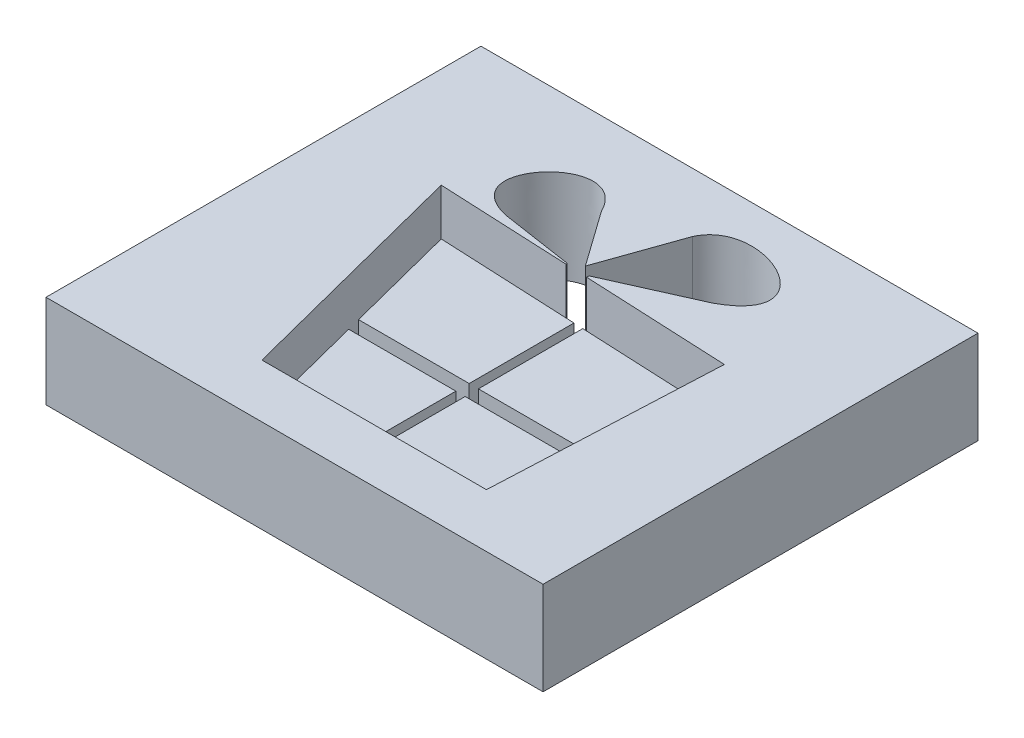
ISO-10303-21;
HEADER;
FILE_DESCRIPTION(('STEP AP214'),'2;1');
FILE_NAME('part.step','',(''),(''),'','','');
FILE_SCHEMA(('AUTOMOTIVE_DESIGN { 1 0 10303 214 1 1 1 1 }'));
ENDSEC;
DATA;
#1=APPLICATION_CONTEXT('core data for automotive mechanical design processes');
#2=APPLICATION_PROTOCOL_DEFINITION('international standard','automotive_design',2000,#1);
#3=PRODUCT_CONTEXT('',#1,'mechanical');
#4=PRODUCT('Part','Part','',(#3));
#5=PRODUCT_RELATED_PRODUCT_CATEGORY('part','',(#4));
#6=PRODUCT_DEFINITION_FORMATION('','',#4);
#7=PRODUCT_DEFINITION_CONTEXT('part definition',#1,'design');
#8=PRODUCT_DEFINITION('design','',#6,#7);
#9=PRODUCT_DEFINITION_SHAPE('','',#8);
#10=(LENGTH_UNIT() NAMED_UNIT(*) SI_UNIT(.MILLI.,.METRE.));
#11=(NAMED_UNIT(*) PLANE_ANGLE_UNIT() SI_UNIT($,.RADIAN.));
#12=(NAMED_UNIT(*) SI_UNIT($,.STERADIAN.) SOLID_ANGLE_UNIT());
#13=UNCERTAINTY_MEASURE_WITH_UNIT(LENGTH_MEASURE(1.E-05),#10,'distance_accuracy_value','');
#14=(GEOMETRIC_REPRESENTATION_CONTEXT(3) GLOBAL_UNCERTAINTY_ASSIGNED_CONTEXT((#13)) GLOBAL_UNIT_ASSIGNED_CONTEXT((#10,
#11,#12)) REPRESENTATION_CONTEXT('',''));
#15=CARTESIAN_POINT('',(0.,0.,0.));
#16=DIRECTION('',(0.,0.,1.));
#17=DIRECTION('',(1.,0.,0.));
#18=AXIS2_PLACEMENT_3D('',#15,#16,#17);
#19=CARTESIAN_POINT('',(0.,3.,0.));
#20=DIRECTION('',(0.,1.,0.));
#21=DIRECTION('',(0.,0.,1.));
#22=AXIS2_PLACEMENT_3D('',#19,#20,#21);
#23=PLANE('',#22);
#24=DIRECTION('',(-0.0462719100433033,0.,0.998928881523077));
#25=VECTOR('',#24,1.);
#26=CARTESIAN_POINT('',(-30.7498081803006,3.,-1.42437803559976));
#27=LINE('',#26,#25);
#28=CARTESIAN_POINT('',(-30.0115129434745,3.,-17.3628693247281));
#29=VERTEX_POINT('',#28);
#30=CARTESIAN_POINT('',(-30.3505741265197,3.,-10.0431367260468));
#31=VERTEX_POINT('',#30);
#32=EDGE_CURVE('E476',#29,#31,#27,.T.);
#33=ORIENTED_EDGE('',*,*,#32,.T.);
#34=DIRECTION('',(-1.,0.,0.));
#35=VECTOR('',#34,1.);
#36=CARTESIAN_POINT('',(0.,3.,-10.0431367260468));
#37=LINE('',#36,#35);
#38=CARTESIAN_POINT('',(-37.5756195592853,3.,-10.0431367260468));
#39=VERTEX_POINT('',#38);
#40=EDGE_CURVE('E474',#31,#39,#37,.T.);
#41=ORIENTED_EDGE('',*,*,#40,.T.);
#42=DIRECTION('',(-0.248559205675402,0.,-0.968616705035595));
#43=VECTOR('',#42,1.);
#44=CARTESIAN_POINT('',(-32.8361631779477,3.,8.42617166781016));
#45=LINE('',#44,#43);
#46=CARTESIAN_POINT('',(-39.56754436517,3.,-17.8055192815914));
#47=VERTEX_POINT('',#46);
#48=EDGE_CURVE('E472',#39,#47,#45,.T.);
#49=ORIENTED_EDGE('',*,*,#48,.T.);
#50=DIRECTION('',(-0.998928881523076,0.,-0.0462719100433034));
#51=VECTOR('',#50,1.);
#52=CARTESIAN_POINT('',(-35.087707092576,3.,-17.5980063834059));
#53=LINE('',#52,#51);
#54=CARTESIAN_POINT('',(-35.3617725375058,3.,-17.6107015130075));
#55=VERTEX_POINT('',#54);
#56=EDGE_CURVE('E248',#55,#47,#53,.T.);
#57=ORIENTED_EDGE('',*,*,#56,.F.);
#58=DIRECTION('',(0.,0.,1.));
#59=VECTOR('',#58,1.);
#60=CARTESIAN_POINT('',(-35.3617725375058,3.,0.));
#61=LINE('',#60,#59);
#62=CARTESIAN_POINT('',(-35.3617725375058,3.,-17.6541575157816));
#63=VERTEX_POINT('',#62);
#64=EDGE_CURVE('E469',#63,#55,#61,.T.);
#65=ORIENTED_EDGE('',*,*,#64,.F.);
#66=DIRECTION('',(0.98874047583337,0.,0.149640473966105));
#67=VECTOR('',#66,1.);
#68=CARTESIAN_POINT('',(1.8202009422397,3.,-12.0268687878527));
#69=LINE('',#68,#67);
#70=CARTESIAN_POINT('',(-37.6692116798901,3.,-18.0033758347984));
#71=VERTEX_POINT('',#70);
#72=EDGE_CURVE('E463',#71,#63,#69,.T.);
#73=ORIENTED_EDGE('',*,*,#72,.F.);
#74=CARTESIAN_POINT('',(-36.2576195279127,3.,-19.6502333454386));
#75=CARTESIAN_POINT('',(-37.3044617868873,3.,-21.7599321493884));
#76=CARTESIAN_POINT('',(-40.1556847180606,3.,-18.5404443526235));
#77=CARTESIAN_POINT('',(-37.6692116798901,3.,-18.0033758347984));
#78=B_SPLINE_CURVE_WITH_KNOTS('',3,(#74,#75,#76,#77),.UNSPECIFIED.,.F.,.F.,(4,4),(0.,1.),.UNSPECIFIED.);
#79=CARTESIAN_POINT('',(-36.2576195279127,3.,-19.6502333454386));
#80=VERTEX_POINT('',#79);
#81=EDGE_CURVE('E459',#80,#71,#78,.T.);
#82=ORIENTED_EDGE('',*,*,#81,.F.);
#83=DIRECTION('',(0.579237483763863,0.,0.815158841823426));
#84=VECTOR('',#83,1.);
#85=CARTESIAN_POINT('',(-14.8143441725471,3.,10.5268114652638));
#86=LINE('',#85,#84);
#87=CARTESIAN_POINT('',(-34.99189926241,3.,-17.8689897370394));
#88=VERTEX_POINT('',#87);
#89=EDGE_CURVE('E294',#80,#88,#86,.T.);
#90=ORIENTED_EDGE('',*,*,#89,.T.);
#91=DIRECTION('',(-0.333335642583817,0.,0.942808225135544));
#92=VECTOR('',#91,1.);
#93=CARTESIAN_POINT('',(-36.7195723222432,3.,-12.9824304764399));
#94=LINE('',#93,#92);
#95=CARTESIAN_POINT('',(-34.0907017507545,3.,-20.4179413579176));
#96=VERTEX_POINT('',#95);
#97=EDGE_CURVE('E298',#96,#88,#94,.T.);
#98=ORIENTED_EDGE('',*,*,#97,.F.);
#99=CARTESIAN_POINT('',(-31.9114015862982,3.,-18.8834351512072));
#100=CARTESIAN_POINT('',(-29.3742741961698,3.,-20.248494332071));
#101=CARTESIAN_POINT('',(-33.3058977177686,3.,-22.1352767339237));
#102=CARTESIAN_POINT('',(-34.0907017507545,3.,-20.4179413579176));
#103=B_SPLINE_CURVE_WITH_KNOTS('',3,(#99,#100,#101,#102),.UNSPECIFIED.,.F.,.F.,(4,4),(0.,1.),.UNSPECIFIED.);
#104=CARTESIAN_POINT('',(-31.9114015862982,3.,-18.8834351512072));
#105=VERTEX_POINT('',#104);
#106=EDGE_CURVE('E483',#105,#96,#103,.T.);
#107=ORIENTED_EDGE('',*,*,#106,.F.);
#108=DIRECTION('',(-0.912754634382309,0.,0.408508234205405));
#109=VECTOR('',#108,1.);
#110=CARTESIAN_POINT('',(-12.3663666828324,3.,-27.6309203954767));
#111=LINE('',#110,#109);
#112=CARTESIAN_POINT('',(-34.6580508940158,3.,-17.6541575157817));
#113=VERTEX_POINT('',#112);
#114=EDGE_CURVE('E481',#105,#113,#111,.T.);
#115=ORIENTED_EDGE('',*,*,#114,.T.);
#116=DIRECTION('',(0.,0.,1.));
#117=VECTOR('',#116,1.);
#118=CARTESIAN_POINT('',(-34.6580508940158,3.,0.));
#119=LINE('',#118,#117);
#120=CARTESIAN_POINT('',(-34.6580508940158,3.,-17.5781040526824));
#121=VERTEX_POINT('',#120);
#122=EDGE_CURVE('E478',#113,#121,#119,.T.);
#123=ORIENTED_EDGE('',*,*,#122,.T.);
#124=EDGE_CURVE('E240',#29,#121,#53,.T.);
#125=ORIENTED_EDGE('',*,*,#124,.F.);
#126=EDGE_LOOP('',(#33,#41,#49,#57,#65,#73,#82,#90,#98,#107,#115,#123,#125));
#127=FACE_BOUND('',#126,.T.);
#128=DIRECTION('',(0.,0.,1.));
#129=VECTOR('',#128,1.);
#130=CARTESIAN_POINT('',(-42.8025477707006,3.,-22.3184713375796));
#131=LINE('',#130,#129);
#132=CARTESIAN_POINT('',(-42.8025477707006,3.,-22.3184713375796));
#133=VERTEX_POINT('',#132);
#134=CARTESIAN_POINT('',(-42.8025477707006,3.,-8.31847133757962));
#135=VERTEX_POINT('',#134);
#136=EDGE_CURVE('E362',#133,#135,#131,.T.);
#137=ORIENTED_EDGE('',*,*,#136,.T.);
#138=DIRECTION('',(1.,0.,0.));
#139=VECTOR('',#138,1.);
#140=CARTESIAN_POINT('',(-42.8025477707006,3.,-8.31847133757962));
#141=LINE('',#140,#139);
#142=CARTESIAN_POINT('',(-26.8025477707006,3.,-8.31847133757962));
#143=VERTEX_POINT('',#142);
#144=EDGE_CURVE('E376',#135,#143,#141,.T.);
#145=ORIENTED_EDGE('',*,*,#144,.T.);
#146=DIRECTION('',(0.,0.,-1.));
#147=VECTOR('',#146,1.);
#148=CARTESIAN_POINT('',(-26.8025477707006,3.,-22.3184713375796));
#149=LINE('',#148,#147);
#150=CARTESIAN_POINT('',(-26.8025477707006,3.,-22.3184713375796));
#151=VERTEX_POINT('',#150);
#152=EDGE_CURVE('E356',#143,#151,#149,.T.);
#153=ORIENTED_EDGE('',*,*,#152,.T.);
#154=DIRECTION('',(-1.,0.,0.));
#155=VECTOR('',#154,1.);
#156=CARTESIAN_POINT('',(-42.8025477707006,3.,-22.3184713375796));
#157=LINE('',#156,#155);
#158=EDGE_CURVE('E369',#151,#133,#157,.T.);
#159=ORIENTED_EDGE('',*,*,#158,.T.);
#160=EDGE_LOOP('',(#137,#145,#153,#159));
#161=FACE_BOUND('',#160,.T.);
#162=ADVANCED_FACE('F34',(#127,#161),#23,.T.);
#163=CARTESIAN_POINT('',(0.,0.,0.));
#164=DIRECTION('',(0.,1.,0.));
#165=DIRECTION('',(0.,0.,1.));
#166=AXIS2_PLACEMENT_3D('',#163,#164,#165);
#167=PLANE('',#166);
#168=DIRECTION('',(0.,0.,1.));
#169=VECTOR('',#168,1.);
#170=CARTESIAN_POINT('',(-42.8025477707006,0.,-22.3184713375796));
#171=LINE('',#170,#169);
#172=CARTESIAN_POINT('',(-42.8025477707006,0.,-22.3184713375796));
#173=VERTEX_POINT('',#172);
#174=CARTESIAN_POINT('',(-42.8025477707006,0.,-8.31847133757962));
#175=VERTEX_POINT('',#174);
#176=EDGE_CURVE('E352',#173,#175,#171,.T.);
#177=ORIENTED_EDGE('',*,*,#176,.F.);
#178=DIRECTION('',(-1.,0.,0.));
#179=VECTOR('',#178,1.);
#180=CARTESIAN_POINT('',(-42.8025477707006,0.,-22.3184713375796));
#181=LINE('',#180,#179);
#182=CARTESIAN_POINT('',(-26.8025477707006,0.,-22.3184713375796));
#183=VERTEX_POINT('',#182);
#184=EDGE_CURVE('E360',#183,#173,#181,.T.);
#185=ORIENTED_EDGE('',*,*,#184,.F.);
#186=DIRECTION('',(0.,0.,-1.));
#187=VECTOR('',#186,1.);
#188=CARTESIAN_POINT('',(-26.8025477707006,0.,-22.3184713375796));
#189=LINE('',#188,#187);
#190=CARTESIAN_POINT('',(-26.8025477707006,0.,-8.31847133757962));
#191=VERTEX_POINT('',#190);
#192=EDGE_CURVE('E351',#191,#183,#189,.T.);
#193=ORIENTED_EDGE('',*,*,#192,.F.);
#194=DIRECTION('',(1.,0.,0.));
#195=VECTOR('',#194,1.);
#196=CARTESIAN_POINT('',(-42.8025477707006,0.,-8.31847133757962));
#197=LINE('',#196,#195);
#198=EDGE_CURVE('E344',#175,#191,#197,.T.);
#199=ORIENTED_EDGE('',*,*,#198,.F.);
#200=EDGE_LOOP('',(#177,#185,#193,#199));
#201=FACE_BOUND('',#200,.T.);
#202=DIRECTION('',(0.579237483763863,0.,0.815158841823426));
#203=VECTOR('',#202,1.);
#204=CARTESIAN_POINT('',(-14.8143441725471,0.,10.5268114652638));
#205=LINE('',#204,#203);
#206=CARTESIAN_POINT('',(-36.2576195279127,0.,-19.6502333454386));
#207=VERTEX_POINT('',#206);
#208=CARTESIAN_POINT('',(-34.99189926241,0.,-17.8689897370394));
#209=VERTEX_POINT('',#208);
#210=EDGE_CURVE('E295',#207,#209,#205,.T.);
#211=ORIENTED_EDGE('',*,*,#210,.F.);
#212=CARTESIAN_POINT('',(-36.2576195279127,0.,-19.6502333454386));
#213=CARTESIAN_POINT('',(-37.3044617868873,0.,-21.7599321493884));
#214=CARTESIAN_POINT('',(-40.1556847180606,0.,-18.5404443526235));
#215=CARTESIAN_POINT('',(-37.6692116798901,0.,-18.0033758347984));
#216=B_SPLINE_CURVE_WITH_KNOTS('',3,(#212,#213,#214,#215),.UNSPECIFIED.,.F.,.F.,(4,4),(0.,1.),.UNSPECIFIED.);
#217=CARTESIAN_POINT('',(-37.6692116798901,0.,-18.0033758347984));
#218=VERTEX_POINT('',#217);
#219=EDGE_CURVE('E297',#207,#218,#216,.T.);
#220=ORIENTED_EDGE('',*,*,#219,.T.);
#221=DIRECTION('',(0.98874047583337,0.,0.149640473966105));
#222=VECTOR('',#221,1.);
#223=CARTESIAN_POINT('',(1.8202009422397,0.,-12.0268687878527));
#224=LINE('',#223,#222);
#225=CARTESIAN_POINT('',(-35.3617725375058,0.,-17.6541575157816));
#226=VERTEX_POINT('',#225);
#227=EDGE_CURVE('E304',#218,#226,#224,.T.);
#228=ORIENTED_EDGE('',*,*,#227,.T.);
#229=DIRECTION('',(0.,0.,1.));
#230=VECTOR('',#229,1.);
#231=CARTESIAN_POINT('',(-35.3617725375058,0.,0.));
#232=LINE('',#231,#230);
#233=CARTESIAN_POINT('',(-35.3617725375058,0.,-17.6107015130075));
#234=VERTEX_POINT('',#233);
#235=EDGE_CURVE('E500',#226,#234,#232,.T.);
#236=ORIENTED_EDGE('',*,*,#235,.T.);
#237=DIRECTION('',(0.998928881523077,0.,0.0462719100433034));
#238=VECTOR('',#237,1.);
#239=CARTESIAN_POINT('',(0.738295236826111,0.,-15.9384912891284));
#240=LINE('',#239,#238);
#241=CARTESIAN_POINT('',(-35.087707092576,0.,-17.5980063834059));
#242=VERTEX_POINT('',#241);
#243=EDGE_CURVE('E502',#234,#242,#240,.T.);
#244=ORIENTED_EDGE('',*,*,#243,.T.);
#245=DIRECTION('',(0.,0.,1.));
#246=VECTOR('',#245,1.);
#247=CARTESIAN_POINT('',(-35.087707092576,0.,0.));
#248=LINE('',#247,#246);
#249=CARTESIAN_POINT('',(-35.087707092576,0.,-14.2248655617998));
#250=VERTEX_POINT('',#249);
#251=EDGE_CURVE('E503',#242,#250,#248,.T.);
#252=ORIENTED_EDGE('',*,*,#251,.T.);
#253=DIRECTION('',(-1.,0.,0.));
#254=VECTOR('',#253,1.);
#255=CARTESIAN_POINT('',(0.,0.,-14.2248655617998));
#256=LINE('',#255,#254);
#257=CARTESIAN_POINT('',(-38.64870367229,0.,-14.2248655617998));
#258=VERTEX_POINT('',#257);
#259=EDGE_CURVE('E508',#250,#258,#256,.T.);
#260=ORIENTED_EDGE('',*,*,#259,.T.);
#261=DIRECTION('',(-0.248559205675402,0.,-0.968616705035595));
#262=VECTOR('',#261,1.);
#263=CARTESIAN_POINT('',(-32.8361631779477,0.,8.42617166781016));
#264=LINE('',#263,#262);
#265=CARTESIAN_POINT('',(-38.5390824361287,0.,-13.7976797720643));
#266=VERTEX_POINT('',#265);
#267=EDGE_CURVE('E511',#266,#258,#264,.T.);
#268=ORIENTED_EDGE('',*,*,#267,.F.);
#269=DIRECTION('',(1.,0.,0.));
#270=VECTOR('',#269,1.);
#271=CARTESIAN_POINT('',(0.,0.,-13.7976797720643));
#272=LINE('',#271,#270);
#273=CARTESIAN_POINT('',(-35.0883272038286,0.,-13.7976797720643));
#274=VERTEX_POINT('',#273);
#275=EDGE_CURVE('E513',#266,#274,#272,.T.);
#276=ORIENTED_EDGE('',*,*,#275,.T.);
#277=DIRECTION('',(0.,0.,1.));
#278=VECTOR('',#277,1.);
#279=CARTESIAN_POINT('',(-35.0883272038286,0.,0.));
#280=LINE('',#279,#278);
#281=CARTESIAN_POINT('',(-35.0883272038286,0.,-10.0431367260468));
#282=VERTEX_POINT('',#281);
#283=EDGE_CURVE('E516',#274,#282,#280,.T.);
#284=ORIENTED_EDGE('',*,*,#283,.T.);
#285=DIRECTION('',(-1.,0.,0.));
#286=VECTOR('',#285,1.);
#287=CARTESIAN_POINT('',(0.,0.,-10.0431367260468));
#288=LINE('',#287,#286);
#289=CARTESIAN_POINT('',(-34.7895286543223,0.,-10.0431367260468));
#290=VERTEX_POINT('',#289);
#291=EDGE_CURVE('E519',#290,#282,#288,.T.);
#292=ORIENTED_EDGE('',*,*,#291,.F.);
#293=DIRECTION('',(0.,0.,-1.));
#294=VECTOR('',#293,1.);
#295=CARTESIAN_POINT('',(-34.7895286543223,0.,0.));
#296=LINE('',#295,#294);
#297=CARTESIAN_POINT('',(-34.7895286543223,0.,-13.7976797720643));
#298=VERTEX_POINT('',#297);
#299=EDGE_CURVE('E521',#290,#298,#296,.T.);
#300=ORIENTED_EDGE('',*,*,#299,.T.);
#301=DIRECTION('',(1.,0.,0.));
#302=VECTOR('',#301,1.);
#303=CARTESIAN_POINT('',(0.,0.,-13.7976797720643));
#304=LINE('',#303,#302);
#305=CARTESIAN_POINT('',(-30.1766579636252,0.,-13.7976797720643));
#306=VERTEX_POINT('',#305);
#307=EDGE_CURVE('E524',#298,#306,#304,.T.);
#308=ORIENTED_EDGE('',*,*,#307,.T.);
#309=DIRECTION('',(-0.0462719100433033,0.,0.998928881523077));
#310=VECTOR('',#309,1.);
#311=CARTESIAN_POINT('',(-30.7498081803006,0.,-1.42437803559976));
#312=LINE('',#311,#310);
#313=CARTESIAN_POINT('',(-30.156870066008,0.,-14.2248655617998));
#314=VERTEX_POINT('',#313);
#315=EDGE_CURVE('E527',#314,#306,#312,.T.);
#316=ORIENTED_EDGE('',*,*,#315,.F.);
#317=DIRECTION('',(-1.,0.,0.));
#318=VECTOR('',#317,1.);
#319=CARTESIAN_POINT('',(0.,0.,-14.2248655617998));
#320=LINE('',#319,#318);
#321=CARTESIAN_POINT('',(-34.7895286543223,0.,-14.2248655617998));
#322=VERTEX_POINT('',#321);
#323=EDGE_CURVE('E529',#314,#322,#320,.T.);
#324=ORIENTED_EDGE('',*,*,#323,.T.);
#325=DIRECTION('',(0.,0.,-1.));
#326=VECTOR('',#325,1.);
#327=CARTESIAN_POINT('',(-34.7895286543223,0.,0.));
#328=LINE('',#327,#326);
#329=CARTESIAN_POINT('',(-34.7895286543223,0.,-17.5841943031598));
#330=VERTEX_POINT('',#329);
#331=EDGE_CURVE('E532',#322,#330,#328,.T.);
#332=ORIENTED_EDGE('',*,*,#331,.T.);
#333=DIRECTION('',(0.998928881523077,0.,0.0462719100433033));
#334=VECTOR('',#333,1.);
#335=CARTESIAN_POINT('',(0.73829523682611,0.,-15.9384912891284));
#336=LINE('',#335,#334);
#337=CARTESIAN_POINT('',(-34.6580508940158,0.,-17.5781040526824));
#338=VERTEX_POINT('',#337);
#339=EDGE_CURVE('E535',#330,#338,#336,.T.);
#340=ORIENTED_EDGE('',*,*,#339,.T.);
#341=DIRECTION('',(0.,0.,1.));
#342=VECTOR('',#341,1.);
#343=CARTESIAN_POINT('',(-34.6580508940158,0.,0.));
#344=LINE('',#343,#342);
#345=CARTESIAN_POINT('',(-34.6580508940158,0.,-17.6541575157817));
#346=VERTEX_POINT('',#345);
#347=EDGE_CURVE('E538',#346,#338,#344,.T.);
#348=ORIENTED_EDGE('',*,*,#347,.F.);
#349=DIRECTION('',(-0.912754634382309,0.,0.408508234205405));
#350=VECTOR('',#349,1.);
#351=CARTESIAN_POINT('',(-12.3663666828324,0.,-27.6309203954767));
#352=LINE('',#351,#350);
#353=CARTESIAN_POINT('',(-31.9114015862982,0.,-18.8834351512072));
#354=VERTEX_POINT('',#353);
#355=EDGE_CURVE('E450',#354,#346,#352,.T.);
#356=ORIENTED_EDGE('',*,*,#355,.F.);
#357=CARTESIAN_POINT('',(-31.9114015862982,0.,-18.8834351512072));
#358=CARTESIAN_POINT('',(-29.3742741961698,0.,-20.248494332071));
#359=CARTESIAN_POINT('',(-33.3058977177686,0.,-22.1352767339237));
#360=CARTESIAN_POINT('',(-34.0907017507545,0.,-20.4179413579176));
#361=B_SPLINE_CURVE_WITH_KNOTS('',3,(#357,#358,#359,#360),.UNSPECIFIED.,.F.,.F.,(4,4),(0.,1.),.UNSPECIFIED.);
#362=CARTESIAN_POINT('',(-34.0907017507545,0.,-20.4179413579176));
#363=VERTEX_POINT('',#362);
#364=EDGE_CURVE('E445',#354,#363,#361,.T.);
#365=ORIENTED_EDGE('',*,*,#364,.T.);
#366=DIRECTION('',(-0.333335642583817,0.,0.942808225135544));
#367=VECTOR('',#366,1.);
#368=CARTESIAN_POINT('',(-36.7195723222432,0.,-12.9824304764399));
#369=LINE('',#368,#367);
#370=EDGE_CURVE('E440',#363,#209,#369,.T.);
#371=ORIENTED_EDGE('',*,*,#370,.T.);
#372=EDGE_LOOP('',(#211,#220,#228,#236,#244,#252,#260,#268,#276,#284,#292,#300,#308,#316,#324,
#332,#340,#348,#356,#365,#371));
#373=FACE_BOUND('',#372,.T.);
#374=ADVANCED_FACE('F325',(#201,#373),#167,.F.);
#375=CARTESIAN_POINT('',(-42.8025477707006,3.,-22.3184713375796));
#376=DIRECTION('',(1.,0.,0.));
#377=DIRECTION('',(0.,0.,-1.));
#378=AXIS2_PLACEMENT_3D('',#375,#376,#377);
#379=PLANE('',#378);
#380=ORIENTED_EDGE('',*,*,#176,.T.);
#381=DIRECTION('',(0.,-1.,0.));
#382=VECTOR('',#381,1.);
#383=CARTESIAN_POINT('',(-42.8025477707006,3.,-8.31847133757962));
#384=LINE('',#383,#382);
#385=EDGE_CURVE('E12',#135,#175,#384,.T.);
#386=ORIENTED_EDGE('',*,*,#385,.F.);
#387=ORIENTED_EDGE('',*,*,#136,.F.);
#388=DIRECTION('',(0.,-1.,0.));
#389=VECTOR('',#388,1.);
#390=CARTESIAN_POINT('',(-42.8025477707006,3.,-22.3184713375796));
#391=LINE('',#390,#389);
#392=EDGE_CURVE('E366',#133,#173,#391,.T.);
#393=ORIENTED_EDGE('',*,*,#392,.T.);
#394=EDGE_LOOP('',(#380,#386,#387,#393));
#395=FACE_BOUND('',#394,.T.);
#396=ADVANCED_FACE('F36',(#395),#379,.F.);
#397=CARTESIAN_POINT('',(-42.8025477707006,3.,-8.31847133757962));
#398=DIRECTION('',(0.,0.,-1.));
#399=DIRECTION('',(-1.,0.,0.));
#400=AXIS2_PLACEMENT_3D('',#397,#398,#399);
#401=PLANE('',#400);
#402=ORIENTED_EDGE('',*,*,#198,.T.);
#403=DIRECTION('',(0.,-1.,0.));
#404=VECTOR('',#403,1.);
#405=CARTESIAN_POINT('',(-26.8025477707006,3.,-8.31847133757962));
#406=LINE('',#405,#404);
#407=EDGE_CURVE('E42',#143,#191,#406,.T.);
#408=ORIENTED_EDGE('',*,*,#407,.F.);
#409=ORIENTED_EDGE('',*,*,#144,.F.);
#410=ORIENTED_EDGE('',*,*,#385,.T.);
#411=EDGE_LOOP('',(#402,#408,#409,#410));
#412=FACE_BOUND('',#411,.T.);
#413=ADVANCED_FACE('F335',(#412),#401,.F.);
#414=CARTESIAN_POINT('',(-26.8025477707006,3.,-22.3184713375796));
#415=DIRECTION('',(-1.,0.,0.));
#416=DIRECTION('',(0.,0.,1.));
#417=AXIS2_PLACEMENT_3D('',#414,#415,#416);
#418=PLANE('',#417);
#419=ORIENTED_EDGE('',*,*,#192,.T.);
#420=DIRECTION('',(0.,-1.,0.));
#421=VECTOR('',#420,1.);
#422=CARTESIAN_POINT('',(-26.8025477707006,3.,-22.3184713375796));
#423=LINE('',#422,#421);
#424=EDGE_CURVE('E357',#151,#183,#423,.T.);
#425=ORIENTED_EDGE('',*,*,#424,.F.);
#426=ORIENTED_EDGE('',*,*,#152,.F.);
#427=ORIENTED_EDGE('',*,*,#407,.T.);
#428=EDGE_LOOP('',(#419,#425,#426,#427));
#429=FACE_BOUND('',#428,.T.);
#430=ADVANCED_FACE('F332',(#429),#418,.F.);
#431=CARTESIAN_POINT('',(-42.8025477707006,3.,-22.3184713375796));
#432=DIRECTION('',(0.,0.,1.));
#433=DIRECTION('',(1.,0.,0.));
#434=AXIS2_PLACEMENT_3D('',#431,#432,#433);
#435=PLANE('',#434);
#436=ORIENTED_EDGE('',*,*,#184,.T.);
#437=ORIENTED_EDGE('',*,*,#392,.F.);
#438=ORIENTED_EDGE('',*,*,#158,.F.);
#439=ORIENTED_EDGE('',*,*,#424,.T.);
#440=EDGE_LOOP('',(#436,#437,#438,#439));
#441=FACE_BOUND('',#440,.T.);
#442=ADVANCED_FACE('F321',(#441),#435,.F.);
#443=CARTESIAN_POINT('',(-14.8143441725471,0.,10.5268114652638));
#444=DIRECTION('',(-0.815158841823426,0.,0.579237483763863));
#445=DIRECTION('',(0.579237483763863,0.,0.815158841823426));
#446=AXIS2_PLACEMENT_3D('',#443,#444,#445);
#447=PLANE('',#446);
#448=ORIENTED_EDGE('',*,*,#89,.F.);
#449=DIRECTION('',(0.,1.,0.));
#450=VECTOR('',#449,1.);
#451=CARTESIAN_POINT('',(-36.2576195279127,0.,-19.6502333454386));
#452=LINE('',#451,#450);
#453=EDGE_CURVE('E437',#207,#80,#452,.T.);
#454=ORIENTED_EDGE('',*,*,#453,.F.);
#455=ORIENTED_EDGE('',*,*,#210,.T.);
#456=DIRECTION('',(0.,1.,0.));
#457=VECTOR('',#456,1.);
#458=CARTESIAN_POINT('',(-34.99189926241,0.,-17.8689897370394));
#459=LINE('',#458,#457);
#460=EDGE_CURVE('E379',#209,#88,#459,.T.);
#461=ORIENTED_EDGE('',*,*,#460,.T.);
#462=EDGE_LOOP('',(#448,#454,#455,#461));
#463=FACE_BOUND('',#462,.T.);
#464=ADVANCED_FACE('F317',(#463),#447,.T.);
#465=CARTESIAN_POINT('',(-36.7195723222432,0.,-12.9824304764399));
#466=DIRECTION('',(-0.942808225135544,0.,-0.333335642583817));
#467=DIRECTION('',(-0.333335642583817,0.,0.942808225135544));
#468=AXIS2_PLACEMENT_3D('',#465,#466,#467);
#469=PLANE('',#468);
#470=ORIENTED_EDGE('',*,*,#97,.T.);
#471=ORIENTED_EDGE('',*,*,#460,.F.);
#472=ORIENTED_EDGE('',*,*,#370,.F.);
#473=DIRECTION('',(0.,1.,0.));
#474=VECTOR('',#473,1.);
#475=CARTESIAN_POINT('',(-34.0907017507545,0.,-20.4179413579176));
#476=LINE('',#475,#474);
#477=EDGE_CURVE('E380',#363,#96,#476,.T.);
#478=ORIENTED_EDGE('',*,*,#477,.T.);
#479=EDGE_LOOP('',(#470,#471,#472,#478));
#480=FACE_BOUND('',#479,.T.);
#481=ADVANCED_FACE('F320',(#480),#469,.F.);
#482=DIRECTION('',(0.,1.,0.));
#483=VECTOR('',#482,1.);
#484=SURFACE_OF_LINEAR_EXTRUSION('',#361,#483);
#485=ORIENTED_EDGE('',*,*,#106,.T.);
#486=ORIENTED_EDGE('',*,*,#477,.F.);
#487=ORIENTED_EDGE('',*,*,#364,.F.);
#488=DIRECTION('',(0.,1.,0.));
#489=VECTOR('',#488,1.);
#490=CARTESIAN_POINT('',(-31.9114015862982,0.,-18.8834351512072));
#491=LINE('',#490,#489);
#492=EDGE_CURVE('E384',#354,#105,#491,.T.);
#493=ORIENTED_EDGE('',*,*,#492,.T.);
#494=EDGE_LOOP('',(#485,#486,#487,#493));
#495=FACE_BOUND('',#494,.T.);
#496=ADVANCED_FACE('F629',(#495),#484,.F.);
#497=CARTESIAN_POINT('',(-12.3663666828324,0.,-27.6309203954767));
#498=DIRECTION('',(-0.408508234205405,0.,-0.912754634382309));
#499=DIRECTION('',(-0.912754634382309,0.,0.408508234205405));
#500=AXIS2_PLACEMENT_3D('',#497,#498,#499);
#501=PLANE('',#500);
#502=ORIENTED_EDGE('',*,*,#114,.F.);
#503=ORIENTED_EDGE('',*,*,#492,.F.);
#504=ORIENTED_EDGE('',*,*,#355,.T.);
#505=DIRECTION('',(0.,1.,0.));
#506=VECTOR('',#505,1.);
#507=CARTESIAN_POINT('',(-34.6580508940158,0.,-17.6541575157817));
#508=LINE('',#507,#506);
#509=EDGE_CURVE('E390',#346,#113,#508,.T.);
#510=ORIENTED_EDGE('',*,*,#509,.T.);
#511=EDGE_LOOP('',(#502,#503,#504,#510));
#512=FACE_BOUND('',#511,.T.);
#513=ADVANCED_FACE('F543',(#512),#501,.T.);
#514=CARTESIAN_POINT('',(-34.6580508940158,0.,0.));
#515=DIRECTION('',(-1.,0.,0.));
#516=DIRECTION('',(0.,0.,1.));
#517=AXIS2_PLACEMENT_3D('',#514,#515,#516);
#518=PLANE('',#517);
#519=ORIENTED_EDGE('',*,*,#122,.F.);
#520=ORIENTED_EDGE('',*,*,#509,.F.);
#521=ORIENTED_EDGE('',*,*,#347,.T.);
#522=DIRECTION('',(0.,1.,0.));
#523=VECTOR('',#522,1.);
#524=CARTESIAN_POINT('',(-34.6580508940158,0.,-17.5781040526824));
#525=LINE('',#524,#523);
#526=CARTESIAN_POINT('',(-34.6580508940158,1.5,-17.5781040526824));
#527=VERTEX_POINT('',#526);
#528=EDGE_CURVE('E392',#338,#527,#525,.T.);
#529=ORIENTED_EDGE('',*,*,#528,.T.);
#530=DIRECTION('',(0.,-1.,0.));
#531=VECTOR('',#530,1.);
#532=CARTESIAN_POINT('',(-34.6580508940158,0.,-17.5781040526824));
#533=LINE('',#532,#531);
#534=EDGE_CURVE('E292',#121,#527,#533,.T.);
#535=ORIENTED_EDGE('',*,*,#534,.F.);
#536=EDGE_LOOP('',(#519,#520,#521,#529,#535));
#537=FACE_BOUND('',#536,.T.);
#538=ADVANCED_FACE('F548',(#537),#518,.T.);
#539=CARTESIAN_POINT('',(0.73829523682611,0.,-15.9384912891284));
#540=DIRECTION('',(-0.0462719100433032,0.,0.998928881523076));
#541=DIRECTION('',(0.998928881523077,0.,0.0462719100433033));
#542=AXIS2_PLACEMENT_3D('',#539,#540,#541);
#543=PLANE('',#542);
#544=DIRECTION('',(0.,1.,0.));
#545=VECTOR('',#544,1.);
#546=CARTESIAN_POINT('',(-34.7895286543223,0.,-17.5841943031598));
#547=LINE('',#546,#545);
#548=CARTESIAN_POINT('',(-34.7895286543223,1.5,-17.5841943031598));
#549=VERTEX_POINT('',#548);
#550=EDGE_CURVE('E395',#330,#549,#547,.T.);
#551=ORIENTED_EDGE('',*,*,#550,.T.);
#552=DIRECTION('',(-0.998928881523076,0.,-0.0462719100433032));
#553=VECTOR('',#552,1.);
#554=CARTESIAN_POINT('',(-30.0115129434745,1.5,-17.3628693247281));
#555=LINE('',#554,#553);
#556=EDGE_CURVE('E556',#527,#549,#555,.T.);
#557=ORIENTED_EDGE('',*,*,#556,.F.);
#558=ORIENTED_EDGE('',*,*,#528,.F.);
#559=ORIENTED_EDGE('',*,*,#339,.F.);
#560=EDGE_LOOP('',(#551,#557,#558,#559));
#561=FACE_BOUND('',#560,.T.);
#562=ADVANCED_FACE('F554',(#561),#543,.F.);
#563=CARTESIAN_POINT('',(-34.7895286543223,0.,0.));
#564=DIRECTION('',(1.,0.,0.));
#565=DIRECTION('',(0.,0.,-1.));
#566=AXIS2_PLACEMENT_3D('',#563,#564,#565);
#567=PLANE('',#566);
#568=DIRECTION('',(0.,1.,0.));
#569=VECTOR('',#568,1.);
#570=CARTESIAN_POINT('',(-34.7895286543223,0.,-14.2248655617998));
#571=LINE('',#570,#569);
#572=CARTESIAN_POINT('',(-34.7895286543223,1.5,-14.2248655617998));
#573=VERTEX_POINT('',#572);
#574=EDGE_CURVE('E398',#322,#573,#571,.T.);
#575=ORIENTED_EDGE('',*,*,#574,.T.);
#576=DIRECTION('',(0.,0.,-1.));
#577=VECTOR('',#576,1.);
#578=CARTESIAN_POINT('',(-34.7895286543223,1.5,0.));
#579=LINE('',#578,#577);
#580=EDGE_CURVE('E49',#573,#549,#579,.T.);
#581=ORIENTED_EDGE('',*,*,#580,.T.);
#582=ORIENTED_EDGE('',*,*,#550,.F.);
#583=ORIENTED_EDGE('',*,*,#331,.F.);
#584=EDGE_LOOP('',(#575,#581,#582,#583));
#585=FACE_BOUND('',#584,.T.);
#586=ADVANCED_FACE('F599',(#585),#567,.F.);
#587=CARTESIAN_POINT('',(0.,0.,-14.2248655617998));
#588=DIRECTION('',(0.,0.,-1.));
#589=DIRECTION('',(-1.,0.,0.));
#590=AXIS2_PLACEMENT_3D('',#587,#588,#589);
#591=PLANE('',#590);
#592=DIRECTION('',(0.,1.,0.));
#593=VECTOR('',#592,1.);
#594=CARTESIAN_POINT('',(-30.156870066008,0.,-14.2248655617998));
#595=LINE('',#594,#593);
#596=CARTESIAN_POINT('',(-30.156870066008,1.5,-14.2248655617998));
#597=VERTEX_POINT('',#596);
#598=EDGE_CURVE('E401',#314,#597,#595,.T.);
#599=ORIENTED_EDGE('',*,*,#598,.T.);
#600=DIRECTION('',(-1.,0.,0.));
#601=VECTOR('',#600,1.);
#602=CARTESIAN_POINT('',(0.,1.5,-14.2248655617998));
#603=LINE('',#602,#601);
#604=EDGE_CURVE('E289',#597,#573,#603,.T.);
#605=ORIENTED_EDGE('',*,*,#604,.T.);
#606=ORIENTED_EDGE('',*,*,#574,.F.);
#607=ORIENTED_EDGE('',*,*,#323,.F.);
#608=EDGE_LOOP('',(#599,#605,#606,#607));
#609=FACE_BOUND('',#608,.T.);
#610=ADVANCED_FACE('F596',(#609),#591,.F.);
#611=CARTESIAN_POINT('',(-30.7498081803006,0.,-1.42437803559976));
#612=DIRECTION('',(-0.998928881523076,0.,-0.0462719100433033));
#613=DIRECTION('',(-0.0462719100433033,0.,0.998928881523077));
#614=AXIS2_PLACEMENT_3D('',#611,#612,#613);
#615=PLANE('',#614);
#616=DIRECTION('',(0.,1.,0.));
#617=VECTOR('',#616,1.);
#618=CARTESIAN_POINT('',(-30.1766579636252,0.,-13.7976797720643));
#619=LINE('',#618,#617);
#620=CARTESIAN_POINT('',(-30.1766579636252,1.5,-13.7976797720643));
#621=VERTEX_POINT('',#620);
#622=EDGE_CURVE('E404',#306,#621,#619,.T.);
#623=ORIENTED_EDGE('',*,*,#622,.T.);
#624=DIRECTION('',(0.0462719100433033,0.,-0.998928881523076));
#625=VECTOR('',#624,1.);
#626=CARTESIAN_POINT('',(-30.3505741265197,1.5,-10.0431367260468));
#627=LINE('',#626,#625);
#628=CARTESIAN_POINT('',(-30.3505741265197,1.5,-10.0431367260468));
#629=VERTEX_POINT('',#628);
#630=EDGE_CURVE('E252',#629,#621,#627,.T.);
#631=ORIENTED_EDGE('',*,*,#630,.F.);
#632=DIRECTION('',(0.,1.,0.));
#633=VECTOR('',#632,1.);
#634=CARTESIAN_POINT('',(-30.3505741265197,1.5,-10.0431367260468));
#635=LINE('',#634,#633);
#636=EDGE_CURVE('E271',#629,#31,#635,.T.);
#637=ORIENTED_EDGE('',*,*,#636,.T.);
#638=ORIENTED_EDGE('',*,*,#32,.F.);
#639=DIRECTION('',(0.,1.,0.));
#640=VECTOR('',#639,1.);
#641=CARTESIAN_POINT('',(-30.0115129434745,1.5,-17.3628693247281));
#642=LINE('',#641,#640);
#643=CARTESIAN_POINT('',(-30.0115129434745,1.5,-17.3628693247281));
#644=VERTEX_POINT('',#643);
#645=EDGE_CURVE('E267',#644,#29,#642,.T.);
#646=ORIENTED_EDGE('',*,*,#645,.F.);
#647=EDGE_CURVE('E264',#597,#644,#627,.T.);
#648=ORIENTED_EDGE('',*,*,#647,.F.);
#649=ORIENTED_EDGE('',*,*,#598,.F.);
#650=ORIENTED_EDGE('',*,*,#315,.T.);
#651=EDGE_LOOP('',(#623,#631,#637,#638,#646,#648,#649,#650));
#652=FACE_BOUND('',#651,.T.);
#653=ADVANCED_FACE('F566',(#652),#615,.T.);
#654=CARTESIAN_POINT('',(0.,0.,-13.7976797720643));
#655=DIRECTION('',(0.,0.,1.));
#656=DIRECTION('',(1.,0.,0.));
#657=AXIS2_PLACEMENT_3D('',#654,#655,#656);
#658=PLANE('',#657);
#659=DIRECTION('',(0.,1.,0.));
#660=VECTOR('',#659,1.);
#661=CARTESIAN_POINT('',(-34.7895286543223,0.,-13.7976797720643));
#662=LINE('',#661,#660);
#663=CARTESIAN_POINT('',(-34.7895286543223,1.5,-13.7976797720643));
#664=VERTEX_POINT('',#663);
#665=EDGE_CURVE('E407',#298,#664,#662,.T.);
#666=ORIENTED_EDGE('',*,*,#665,.T.);
#667=DIRECTION('',(1.,0.,0.));
#668=VECTOR('',#667,1.);
#669=CARTESIAN_POINT('',(0.,1.5,-13.7976797720643));
#670=LINE('',#669,#668);
#671=EDGE_CURVE('E57',#664,#621,#670,.T.);
#672=ORIENTED_EDGE('',*,*,#671,.T.);
#673=ORIENTED_EDGE('',*,*,#622,.F.);
#674=ORIENTED_EDGE('',*,*,#307,.F.);
#675=EDGE_LOOP('',(#666,#672,#673,#674));
#676=FACE_BOUND('',#675,.T.);
#677=ADVANCED_FACE('F604',(#676),#658,.F.);
#678=CARTESIAN_POINT('',(-34.7895286543223,0.,0.));
#679=DIRECTION('',(1.,0.,0.));
#680=DIRECTION('',(0.,0.,-1.));
#681=AXIS2_PLACEMENT_3D('',#678,#679,#680);
#682=PLANE('',#681);
#683=DIRECTION('',(0.,1.,0.));
#684=VECTOR('',#683,1.);
#685=CARTESIAN_POINT('',(-34.7895286543223,0.,-10.0431367260468));
#686=LINE('',#685,#684);
#687=CARTESIAN_POINT('',(-34.7895286543223,1.5,-10.0431367260468));
#688=VERTEX_POINT('',#687);
#689=EDGE_CURVE('E410',#290,#688,#686,.T.);
#690=ORIENTED_EDGE('',*,*,#689,.T.);
#691=DIRECTION('',(0.,0.,-1.));
#692=VECTOR('',#691,1.);
#693=CARTESIAN_POINT('',(-34.7895286543223,1.5,0.));
#694=LINE('',#693,#692);
#695=EDGE_CURVE('E286',#688,#664,#694,.T.);
#696=ORIENTED_EDGE('',*,*,#695,.T.);
#697=ORIENTED_EDGE('',*,*,#665,.F.);
#698=ORIENTED_EDGE('',*,*,#299,.F.);
#699=EDGE_LOOP('',(#690,#696,#697,#698));
#700=FACE_BOUND('',#699,.T.);
#701=ADVANCED_FACE('F607',(#700),#682,.F.);
#702=CARTESIAN_POINT('',(0.,0.,-10.0431367260468));
#703=DIRECTION('',(0.,0.,-1.));
#704=DIRECTION('',(-1.,0.,0.));
#705=AXIS2_PLACEMENT_3D('',#702,#703,#704);
#706=PLANE('',#705);
#707=DIRECTION('',(0.,1.,0.));
#708=VECTOR('',#707,1.);
#709=CARTESIAN_POINT('',(-35.0883272038286,0.,-10.0431367260468));
#710=LINE('',#709,#708);
#711=CARTESIAN_POINT('',(-35.0883272038286,1.5,-10.0431367260468));
#712=VERTEX_POINT('',#711);
#713=EDGE_CURVE('E413',#282,#712,#710,.T.);
#714=ORIENTED_EDGE('',*,*,#713,.T.);
#715=DIRECTION('',(1.,0.,0.));
#716=VECTOR('',#715,1.);
#717=CARTESIAN_POINT('',(-37.5756195592853,1.5,-10.0431367260468));
#718=LINE('',#717,#716);
#719=CARTESIAN_POINT('',(-37.5756195592853,1.5,-10.0431367260468));
#720=VERTEX_POINT('',#719);
#721=EDGE_CURVE('E261',#720,#712,#718,.T.);
#722=ORIENTED_EDGE('',*,*,#721,.F.);
#723=DIRECTION('',(0.,1.,0.));
#724=VECTOR('',#723,1.);
#725=CARTESIAN_POINT('',(-37.5756195592853,1.5,-10.0431367260468));
#726=LINE('',#725,#724);
#727=EDGE_CURVE('E251',#720,#39,#726,.T.);
#728=ORIENTED_EDGE('',*,*,#727,.T.);
#729=ORIENTED_EDGE('',*,*,#40,.F.);
#730=ORIENTED_EDGE('',*,*,#636,.F.);
#731=EDGE_CURVE('E258',#688,#629,#718,.T.);
#732=ORIENTED_EDGE('',*,*,#731,.F.);
#733=ORIENTED_EDGE('',*,*,#689,.F.);
#734=ORIENTED_EDGE('',*,*,#291,.T.);
#735=EDGE_LOOP('',(#714,#722,#728,#729,#730,#732,#733,#734));
#736=FACE_BOUND('',#735,.T.);
#737=ADVANCED_FACE('F571',(#736),#706,.T.);
#738=CARTESIAN_POINT('',(-35.0883272038286,0.,0.));
#739=DIRECTION('',(-1.,0.,0.));
#740=DIRECTION('',(0.,0.,1.));
#741=AXIS2_PLACEMENT_3D('',#738,#739,#740);
#742=PLANE('',#741);
#743=DIRECTION('',(0.,1.,0.));
#744=VECTOR('',#743,1.);
#745=CARTESIAN_POINT('',(-35.0883272038286,0.,-13.7976797720643));
#746=LINE('',#745,#744);
#747=CARTESIAN_POINT('',(-35.0883272038286,1.5,-13.7976797720643));
#748=VERTEX_POINT('',#747);
#749=EDGE_CURVE('E416',#274,#748,#746,.T.);
#750=ORIENTED_EDGE('',*,*,#749,.T.);
#751=DIRECTION('',(0.,0.,1.));
#752=VECTOR('',#751,1.);
#753=CARTESIAN_POINT('',(-35.0883272038286,1.5,0.));
#754=LINE('',#753,#752);
#755=EDGE_CURVE('E283',#748,#712,#754,.T.);
#756=ORIENTED_EDGE('',*,*,#755,.T.);
#757=ORIENTED_EDGE('',*,*,#713,.F.);
#758=ORIENTED_EDGE('',*,*,#283,.F.);
#759=EDGE_LOOP('',(#750,#756,#757,#758));
#760=FACE_BOUND('',#759,.T.);
#761=ADVANCED_FACE('F579',(#760),#742,.F.);
#762=CARTESIAN_POINT('',(0.,0.,-13.7976797720643));
#763=DIRECTION('',(0.,0.,1.));
#764=DIRECTION('',(1.,0.,0.));
#765=AXIS2_PLACEMENT_3D('',#762,#763,#764);
#766=PLANE('',#765);
#767=DIRECTION('',(0.,1.,0.));
#768=VECTOR('',#767,1.);
#769=CARTESIAN_POINT('',(-38.5390824361287,0.,-13.7976797720643));
#770=LINE('',#769,#768);
#771=CARTESIAN_POINT('',(-38.5390824361287,1.5,-13.7976797720643));
#772=VERTEX_POINT('',#771);
#773=EDGE_CURVE('E419',#266,#772,#770,.T.);
#774=ORIENTED_EDGE('',*,*,#773,.T.);
#775=DIRECTION('',(1.,0.,0.));
#776=VECTOR('',#775,1.);
#777=CARTESIAN_POINT('',(0.,1.5,-13.7976797720643));
#778=LINE('',#777,#776);
#779=EDGE_CURVE('E280',#772,#748,#778,.T.);
#780=ORIENTED_EDGE('',*,*,#779,.T.);
#781=ORIENTED_EDGE('',*,*,#749,.F.);
#782=ORIENTED_EDGE('',*,*,#275,.F.);
#783=EDGE_LOOP('',(#774,#780,#781,#782));
#784=FACE_BOUND('',#783,.T.);
#785=ADVANCED_FACE('F583',(#784),#766,.F.);
#786=CARTESIAN_POINT('',(-32.8361631779477,0.,8.42617166781016));
#787=DIRECTION('',(0.968616705035595,0.,-0.248559205675402));
#788=DIRECTION('',(-0.248559205675402,0.,-0.968616705035595));
#789=AXIS2_PLACEMENT_3D('',#786,#787,#788);
#790=PLANE('',#789);
#791=DIRECTION('',(0.,1.,0.));
#792=VECTOR('',#791,1.);
#793=CARTESIAN_POINT('',(-38.64870367229,0.,-14.2248655617998));
#794=LINE('',#793,#792);
#795=CARTESIAN_POINT('',(-38.64870367229,1.5,-14.2248655617998));
#796=VERTEX_POINT('',#795);
#797=EDGE_CURVE('E257',#258,#796,#794,.T.);
#798=ORIENTED_EDGE('',*,*,#797,.T.);
#799=DIRECTION('',(0.248559205675402,0.,0.968616705035595));
#800=VECTOR('',#799,1.);
#801=CARTESIAN_POINT('',(-39.56754436517,1.5,-17.8055192815914));
#802=LINE('',#801,#800);
#803=CARTESIAN_POINT('',(-39.56754436517,1.5,-17.8055192815914));
#804=VERTEX_POINT('',#803);
#805=EDGE_CURVE('E234',#804,#796,#802,.T.);
#806=ORIENTED_EDGE('',*,*,#805,.F.);
#807=DIRECTION('',(0.,1.,0.));
#808=VECTOR('',#807,1.);
#809=CARTESIAN_POINT('',(-39.56754436517,1.5,-17.8055192815914));
#810=LINE('',#809,#808);
#811=EDGE_CURVE('E245',#804,#47,#810,.T.);
#812=ORIENTED_EDGE('',*,*,#811,.T.);
#813=ORIENTED_EDGE('',*,*,#48,.F.);
#814=ORIENTED_EDGE('',*,*,#727,.F.);
#815=EDGE_CURVE('E259',#772,#720,#802,.T.);
#816=ORIENTED_EDGE('',*,*,#815,.F.);
#817=ORIENTED_EDGE('',*,*,#773,.F.);
#818=ORIENTED_EDGE('',*,*,#267,.T.);
#819=EDGE_LOOP('',(#798,#806,#812,#813,#814,#816,#817,#818));
#820=FACE_BOUND('',#819,.T.);
#821=ADVANCED_FACE('F255',(#820),#790,.T.);
#822=CARTESIAN_POINT('',(0.,0.,-14.2248655617998));
#823=DIRECTION('',(0.,0.,-1.));
#824=DIRECTION('',(-1.,0.,0.));
#825=AXIS2_PLACEMENT_3D('',#822,#823,#824);
#826=PLANE('',#825);
#827=DIRECTION('',(0.,1.,0.));
#828=VECTOR('',#827,1.);
#829=CARTESIAN_POINT('',(-35.087707092576,0.,-14.2248655617998));
#830=LINE('',#829,#828);
#831=CARTESIAN_POINT('',(-35.087707092576,1.5,-14.2248655617998));
#832=VERTEX_POINT('',#831);
#833=EDGE_CURVE('E423',#250,#832,#830,.T.);
#834=ORIENTED_EDGE('',*,*,#833,.T.);
#835=DIRECTION('',(-1.,0.,0.));
#836=VECTOR('',#835,1.);
#837=CARTESIAN_POINT('',(0.,1.5,-14.2248655617998));
#838=LINE('',#837,#836);
#839=EDGE_CURVE('E278',#832,#796,#838,.T.);
#840=ORIENTED_EDGE('',*,*,#839,.T.);
#841=ORIENTED_EDGE('',*,*,#797,.F.);
#842=ORIENTED_EDGE('',*,*,#259,.F.);
#843=EDGE_LOOP('',(#834,#840,#841,#842));
#844=FACE_BOUND('',#843,.T.);
#845=ADVANCED_FACE('F587',(#844),#826,.F.);
#846=CARTESIAN_POINT('',(-35.087707092576,0.,0.));
#847=DIRECTION('',(-1.,0.,0.));
#848=DIRECTION('',(0.,0.,1.));
#849=AXIS2_PLACEMENT_3D('',#846,#847,#848);
#850=PLANE('',#849);
#851=DIRECTION('',(0.,1.,0.));
#852=VECTOR('',#851,1.);
#853=CARTESIAN_POINT('',(-35.087707092576,0.,-17.5980063834059));
#854=LINE('',#853,#852);
#855=CARTESIAN_POINT('',(-35.087707092576,1.5,-17.5980063834059));
#856=VERTEX_POINT('',#855);
#857=EDGE_CURVE('E426',#242,#856,#854,.T.);
#858=ORIENTED_EDGE('',*,*,#857,.T.);
#859=DIRECTION('',(0.,0.,1.));
#860=VECTOR('',#859,1.);
#861=CARTESIAN_POINT('',(-35.087707092576,1.5,0.));
#862=LINE('',#861,#860);
#863=EDGE_CURVE('E270',#856,#832,#862,.T.);
#864=ORIENTED_EDGE('',*,*,#863,.T.);
#865=ORIENTED_EDGE('',*,*,#833,.F.);
#866=ORIENTED_EDGE('',*,*,#251,.F.);
#867=EDGE_LOOP('',(#858,#864,#865,#866));
#868=FACE_BOUND('',#867,.T.);
#869=ADVANCED_FACE('F591',(#868),#850,.F.);
#870=CARTESIAN_POINT('',(0.738295236826111,0.,-15.9384912891284));
#871=DIRECTION('',(-0.0462719100433033,0.,0.998928881523076));
#872=DIRECTION('',(0.998928881523077,0.,0.0462719100433034));
#873=AXIS2_PLACEMENT_3D('',#870,#871,#872);
#874=PLANE('',#873);
#875=DIRECTION('',(0.,1.,0.));
#876=VECTOR('',#875,1.);
#877=CARTESIAN_POINT('',(-35.3617725375058,0.,-17.6107015130075));
#878=LINE('',#877,#876);
#879=CARTESIAN_POINT('',(-35.3617725375058,1.5,-17.6107015130075));
#880=VERTEX_POINT('',#879);
#881=EDGE_CURVE('E429',#234,#880,#878,.T.);
#882=ORIENTED_EDGE('',*,*,#881,.T.);
#883=EDGE_CURVE('E237',#856,#880,#555,.T.);
#884=ORIENTED_EDGE('',*,*,#883,.F.);
#885=ORIENTED_EDGE('',*,*,#857,.F.);
#886=ORIENTED_EDGE('',*,*,#243,.F.);
#887=EDGE_LOOP('',(#882,#884,#885,#886));
#888=FACE_BOUND('',#887,.T.);
#889=ADVANCED_FACE('F593',(#888),#874,.F.);
#890=CARTESIAN_POINT('',(-35.3617725375058,0.,0.));
#891=DIRECTION('',(-1.,0.,0.));
#892=DIRECTION('',(0.,0.,1.));
#893=AXIS2_PLACEMENT_3D('',#890,#891,#892);
#894=PLANE('',#893);
#895=ORIENTED_EDGE('',*,*,#64,.T.);
#896=EDGE_CURVE('E432',#880,#55,#878,.T.);
#897=ORIENTED_EDGE('',*,*,#896,.F.);
#898=ORIENTED_EDGE('',*,*,#881,.F.);
#899=ORIENTED_EDGE('',*,*,#235,.F.);
#900=DIRECTION('',(0.,1.,0.));
#901=VECTOR('',#900,1.);
#902=CARTESIAN_POINT('',(-35.3617725375058,0.,-17.6541575157816));
#903=LINE('',#902,#901);
#904=EDGE_CURVE('E433',#226,#63,#903,.T.);
#905=ORIENTED_EDGE('',*,*,#904,.T.);
#906=EDGE_LOOP('',(#895,#897,#898,#899,#905));
#907=FACE_BOUND('',#906,.T.);
#908=ADVANCED_FACE('F661',(#907),#894,.F.);
#909=CARTESIAN_POINT('',(1.8202009422397,0.,-12.0268687878527));
#910=DIRECTION('',(-0.149640473966105,0.,0.98874047583337));
#911=DIRECTION('',(0.98874047583337,0.,0.149640473966105));
#912=AXIS2_PLACEMENT_3D('',#909,#910,#911);
#913=PLANE('',#912);
#914=ORIENTED_EDGE('',*,*,#72,.T.);
#915=ORIENTED_EDGE('',*,*,#904,.F.);
#916=ORIENTED_EDGE('',*,*,#227,.F.);
#917=DIRECTION('',(0.,1.,0.));
#918=VECTOR('',#917,1.);
#919=CARTESIAN_POINT('',(-37.6692116798901,0.,-18.0033758347984));
#920=LINE('',#919,#918);
#921=EDGE_CURVE('E435',#218,#71,#920,.T.);
#922=ORIENTED_EDGE('',*,*,#921,.T.);
#923=EDGE_LOOP('',(#914,#915,#916,#922));
#924=FACE_BOUND('',#923,.T.);
#925=ADVANCED_FACE('F314',(#924),#913,.F.);
#926=DIRECTION('',(0.,1.,0.));
#927=VECTOR('',#926,1.);
#928=SURFACE_OF_LINEAR_EXTRUSION('',#216,#927);
#929=ORIENTED_EDGE('',*,*,#81,.T.);
#930=ORIENTED_EDGE('',*,*,#921,.F.);
#931=ORIENTED_EDGE('',*,*,#219,.F.);
#932=ORIENTED_EDGE('',*,*,#453,.T.);
#933=EDGE_LOOP('',(#929,#930,#931,#932));
#934=FACE_BOUND('',#933,.T.);
#935=ADVANCED_FACE('F310',(#934),#928,.F.);
#936=CARTESIAN_POINT('',(-35.087707092576,1.5,-17.5980063834059));
#937=DIRECTION('',(0.0462719100433033,0.,-0.998928881523076));
#938=DIRECTION('',(-0.998928881523077,0.,-0.0462719100433034));
#939=AXIS2_PLACEMENT_3D('',#936,#937,#938);
#940=PLANE('',#939);
#941=ORIENTED_EDGE('',*,*,#56,.T.);
#942=ORIENTED_EDGE('',*,*,#811,.F.);
#943=EDGE_CURVE('E230',#880,#804,#555,.T.);
#944=ORIENTED_EDGE('',*,*,#943,.F.);
#945=ORIENTED_EDGE('',*,*,#896,.T.);
#946=EDGE_LOOP('',(#941,#942,#944,#945));
#947=FACE_BOUND('',#946,.T.);
#948=ADVANCED_FACE('F246',(#947),#940,.F.);
#949=CARTESIAN_POINT('',(0.,1.5,0.));
#950=DIRECTION('',(0.,-1.,0.));
#951=DIRECTION('',(0.,0.,-1.));
#952=AXIS2_PLACEMENT_3D('',#949,#950,#951);
#953=PLANE('',#952);
#954=ORIENTED_EDGE('',*,*,#863,.F.);
#955=ORIENTED_EDGE('',*,*,#883,.T.);
#956=ORIENTED_EDGE('',*,*,#943,.T.);
#957=ORIENTED_EDGE('',*,*,#805,.T.);
#958=ORIENTED_EDGE('',*,*,#839,.F.);
#959=EDGE_LOOP('',(#954,#955,#956,#957,#958));
#960=FACE_BOUND('',#959,.T.);
#961=ADVANCED_FACE('F232',(#960),#953,.F.);
#962=ORIENTED_EDGE('',*,*,#779,.F.);
#963=ORIENTED_EDGE('',*,*,#815,.T.);
#964=ORIENTED_EDGE('',*,*,#721,.T.);
#965=ORIENTED_EDGE('',*,*,#755,.F.);
#966=EDGE_LOOP('',(#962,#963,#964,#965));
#967=FACE_BOUND('',#966,.T.);
#968=ADVANCED_FACE('F577',(#967),#953,.F.);
#969=ORIENTED_EDGE('',*,*,#695,.F.);
#970=ORIENTED_EDGE('',*,*,#731,.T.);
#971=ORIENTED_EDGE('',*,*,#630,.T.);
#972=ORIENTED_EDGE('',*,*,#671,.F.);
#973=EDGE_LOOP('',(#969,#970,#971,#972));
#974=FACE_BOUND('',#973,.T.);
#975=ADVANCED_FACE('F609',(#974),#953,.F.);
#976=ORIENTED_EDGE('',*,*,#534,.T.);
#977=EDGE_CURVE('E242',#644,#527,#555,.T.);
#978=ORIENTED_EDGE('',*,*,#977,.F.);
#979=ORIENTED_EDGE('',*,*,#645,.T.);
#980=ORIENTED_EDGE('',*,*,#124,.T.);
#981=EDGE_LOOP('',(#976,#978,#979,#980));
#982=FACE_BOUND('',#981,.T.);
#983=ADVANCED_FACE('F562',(#982),#940,.F.);
#984=ORIENTED_EDGE('',*,*,#604,.F.);
#985=ORIENTED_EDGE('',*,*,#647,.T.);
#986=ORIENTED_EDGE('',*,*,#977,.T.);
#987=ORIENTED_EDGE('',*,*,#556,.T.);
#988=ORIENTED_EDGE('',*,*,#580,.F.);
#989=EDGE_LOOP('',(#984,#985,#986,#987,#988));
#990=FACE_BOUND('',#989,.T.);
#991=ADVANCED_FACE('F594',(#990),#953,.F.);
#992=CLOSED_SHELL('',(#162,#374,#396,#413,#430,#442,#464,#481,#496,#513,#538,#562,#586,#610,
#653,#677,#701,#737,#761,#785,#821,#845,#869,#889,#908,#925,#935,#948,#961,#968,#975,#983,#991));
#993=MANIFOLD_SOLID_BREP('B2',#992);
#994=ADVANCED_BREP_SHAPE_REPRESENTATION('',(#18,#993),#14);
#995=SHAPE_DEFINITION_REPRESENTATION(#9,#994);
ENDSEC;
END-ISO-10303-21;
